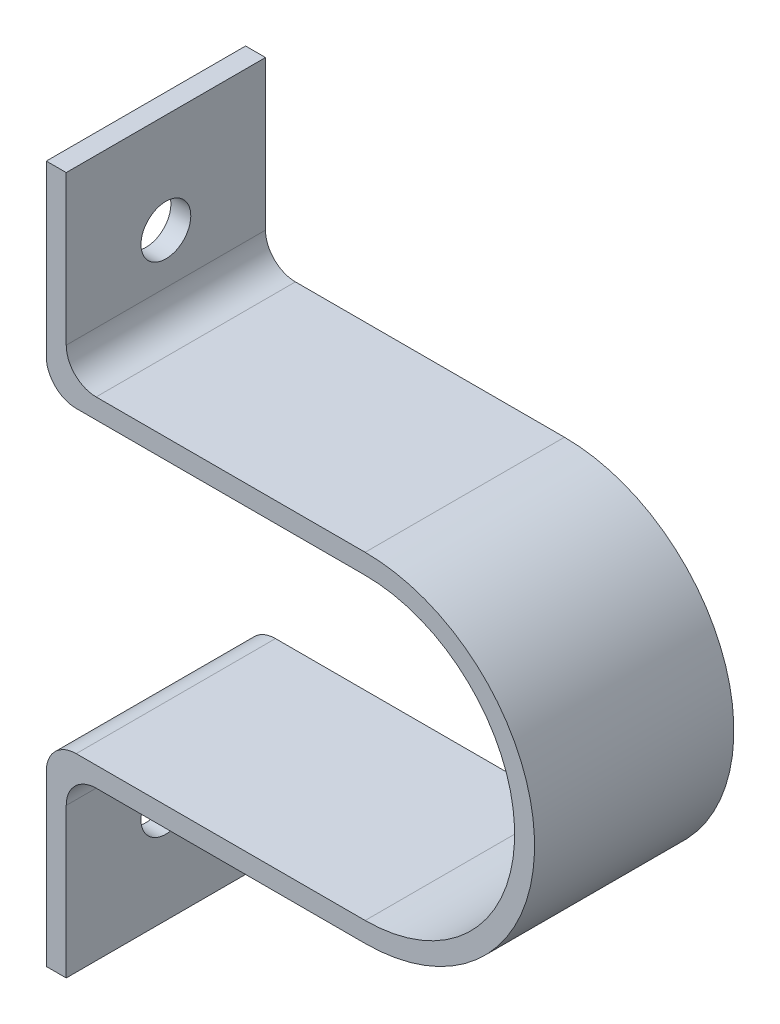
ISO-10303-21;
HEADER;
FILE_DESCRIPTION(('STEP AP214'),'2;1');
FILE_NAME('part.step','',(''),(''),'','','');
FILE_SCHEMA(('AUTOMOTIVE_DESIGN { 1 0 10303 214 1 1 1 1 }'));
ENDSEC;
DATA;
#1=APPLICATION_CONTEXT('core data for automotive mechanical design processes');
#2=APPLICATION_PROTOCOL_DEFINITION('international standard','automotive_design',2000,#1);
#3=PRODUCT_CONTEXT('',#1,'mechanical');
#4=PRODUCT('Part','Part','',(#3));
#5=PRODUCT_RELATED_PRODUCT_CATEGORY('part','',(#4));
#6=PRODUCT_DEFINITION_FORMATION('','',#4);
#7=PRODUCT_DEFINITION_CONTEXT('part definition',#1,'design');
#8=PRODUCT_DEFINITION('design','',#6,#7);
#9=PRODUCT_DEFINITION_SHAPE('','',#8);
#10=(LENGTH_UNIT() NAMED_UNIT(*) SI_UNIT(.MILLI.,.METRE.));
#11=(NAMED_UNIT(*) PLANE_ANGLE_UNIT() SI_UNIT($,.RADIAN.));
#12=(NAMED_UNIT(*) SI_UNIT($,.STERADIAN.) SOLID_ANGLE_UNIT());
#13=UNCERTAINTY_MEASURE_WITH_UNIT(LENGTH_MEASURE(1.E-05),#10,'distance_accuracy_value','');
#14=(GEOMETRIC_REPRESENTATION_CONTEXT(3) GLOBAL_UNCERTAINTY_ASSIGNED_CONTEXT((#13)) GLOBAL_UNIT_ASSIGNED_CONTEXT((#10,
#11,#12)) REPRESENTATION_CONTEXT('',''));
#15=CARTESIAN_POINT('',(0.,0.,0.));
#16=DIRECTION('',(0.,0.,1.));
#17=DIRECTION('',(1.,0.,0.));
#18=AXIS2_PLACEMENT_3D('',#15,#16,#17);
#19=CARTESIAN_POINT('',(40.,-37.,-30.));
#20=DIRECTION('',(0.,-1.,0.));
#21=DIRECTION('',(0.,0.,-1.));
#22=AXIS2_PLACEMENT_3D('',#19,#20,#21);
#23=PLANE('',#22);
#24=DIRECTION('',(1.,0.,0.));
#25=VECTOR('',#24,1.);
#26=CARTESIAN_POINT('',(40.,-37.,-10.));
#27=LINE('',#26,#25);
#28=CARTESIAN_POINT('',(13.,-37.,-10.));
#29=VERTEX_POINT('',#28);
#30=CARTESIAN_POINT('',(40.,-37.,-10.));
#31=VERTEX_POINT('',#30);
#32=EDGE_CURVE('E194',#29,#31,#27,.T.);
#33=ORIENTED_EDGE('',*,*,#32,.F.);
#34=DIRECTION('',(0.,0.,1.));
#35=VECTOR('',#34,1.);
#36=CARTESIAN_POINT('',(13.,-37.,-30.));
#37=LINE('',#36,#35);
#38=CARTESIAN_POINT('',(13.,-37.,-30.));
#39=VERTEX_POINT('',#38);
#40=EDGE_CURVE('E150',#29,#39,#37,.F.);
#41=ORIENTED_EDGE('',*,*,#40,.T.);
#42=DIRECTION('',(1.,0.,0.));
#43=VECTOR('',#42,1.);
#44=CARTESIAN_POINT('',(40.,-37.,-30.));
#45=LINE('',#44,#43);
#46=CARTESIAN_POINT('',(40.,-37.,-30.));
#47=VERTEX_POINT('',#46);
#48=EDGE_CURVE('E144',#39,#47,#45,.T.);
#49=ORIENTED_EDGE('',*,*,#48,.T.);
#50=DIRECTION('',(0.,0.,1.));
#51=VECTOR('',#50,1.);
#52=CARTESIAN_POINT('',(40.,-37.,-30.));
#53=LINE('',#52,#51);
#54=EDGE_CURVE('E147',#47,#31,#53,.T.);
#55=ORIENTED_EDGE('',*,*,#54,.T.);
#56=EDGE_LOOP('',(#33,#41,#49,#55));
#57=FACE_BOUND('',#56,.T.);
#58=ADVANCED_FACE('F31',(#57),#23,.T.);
#59=CARTESIAN_POINT('',(10.,-37.,-30.));
#60=DIRECTION('',(1.,0.,0.));
#61=DIRECTION('',(0.,1.,0.));
#62=AXIS2_PLACEMENT_3D('',#59,#60,#61);
#63=PLANE('',#62);
#64=CARTESIAN_POINT('',(10.,-45.,-20.));
#65=DIRECTION('',(1.,0.,0.));
#66=DIRECTION('',(0.,1.,0.));
#67=AXIS2_PLACEMENT_3D('',#64,#65,#66);
#68=CIRCLE('',#67,2.5);
#69=CARTESIAN_POINT('',(10.,-42.5,-20.));
#70=VERTEX_POINT('',#69);
#71=EDGE_CURVE('E499',#70,#70,#68,.T.);
#72=ORIENTED_EDGE('',*,*,#71,.F.);
#73=EDGE_LOOP('',(#72));
#74=FACE_BOUND('',#73,.T.);
#75=DIRECTION('',(0.,1.,0.));
#76=VECTOR('',#75,1.);
#77=CARTESIAN_POINT('',(10.,-37.,-30.));
#78=LINE('',#77,#76);
#79=CARTESIAN_POINT('',(10.,-55.,-30.));
#80=VERTEX_POINT('',#79);
#81=CARTESIAN_POINT('',(10.,-40.,-30.));
#82=VERTEX_POINT('',#81);
#83=EDGE_CURVE('E162',#80,#82,#78,.T.);
#84=ORIENTED_EDGE('',*,*,#83,.T.);
#85=DIRECTION('',(0.,0.,1.));
#86=VECTOR('',#85,1.);
#87=CARTESIAN_POINT('',(10.,-40.,-10.));
#88=LINE('',#87,#86);
#89=CARTESIAN_POINT('',(10.,-40.,-10.));
#90=VERTEX_POINT('',#89);
#91=EDGE_CURVE('E226',#82,#90,#88,.T.);
#92=ORIENTED_EDGE('',*,*,#91,.T.);
#93=DIRECTION('',(0.,1.,0.));
#94=VECTOR('',#93,1.);
#95=CARTESIAN_POINT('',(10.,-37.,-10.));
#96=LINE('',#95,#94);
#97=CARTESIAN_POINT('',(10.,-55.,-10.));
#98=VERTEX_POINT('',#97);
#99=EDGE_CURVE('E154',#98,#90,#96,.T.);
#100=ORIENTED_EDGE('',*,*,#99,.F.);
#101=DIRECTION('',(0.,0.,1.));
#102=VECTOR('',#101,1.);
#103=CARTESIAN_POINT('',(10.,-55.,-30.));
#104=LINE('',#103,#102);
#105=EDGE_CURVE('E224',#80,#98,#104,.T.);
#106=ORIENTED_EDGE('',*,*,#105,.F.);
#107=EDGE_LOOP('',(#84,#92,#100,#106));
#108=FACE_BOUND('',#107,.T.);
#109=ADVANCED_FACE('F285',(#74,#108),#63,.T.);
#110=CARTESIAN_POINT('',(8.,-55.,-30.));
#111=DIRECTION('',(0.,-1.,0.));
#112=DIRECTION('',(0.,0.,-1.));
#113=AXIS2_PLACEMENT_3D('',#110,#111,#112);
#114=PLANE('',#113);
#115=DIRECTION('',(1.,0.,0.));
#116=VECTOR('',#115,1.);
#117=CARTESIAN_POINT('',(8.,-55.,-10.));
#118=LINE('',#117,#116);
#119=CARTESIAN_POINT('',(8.,-55.,-10.));
#120=VERTEX_POINT('',#119);
#121=EDGE_CURVE('E219',#120,#98,#118,.T.);
#122=ORIENTED_EDGE('',*,*,#121,.F.);
#123=DIRECTION('',(0.,0.,1.));
#124=VECTOR('',#123,1.);
#125=CARTESIAN_POINT('',(8.,-55.,-30.));
#126=LINE('',#125,#124);
#127=CARTESIAN_POINT('',(8.,-55.,-30.));
#128=VERTEX_POINT('',#127);
#129=EDGE_CURVE('E227',#128,#120,#126,.T.);
#130=ORIENTED_EDGE('',*,*,#129,.F.);
#131=DIRECTION('',(1.,0.,0.));
#132=VECTOR('',#131,1.);
#133=CARTESIAN_POINT('',(8.,-55.,-30.));
#134=LINE('',#133,#132);
#135=EDGE_CURVE('E189',#128,#80,#134,.T.);
#136=ORIENTED_EDGE('',*,*,#135,.T.);
#137=ORIENTED_EDGE('',*,*,#105,.T.);
#138=EDGE_LOOP('',(#122,#130,#136,#137));
#139=FACE_BOUND('',#138,.T.);
#140=ADVANCED_FACE('F290',(#139),#114,.T.);
#141=CARTESIAN_POINT('',(8.,-35.,-30.));
#142=DIRECTION('',(-1.,0.,0.));
#143=DIRECTION('',(0.,0.,1.));
#144=AXIS2_PLACEMENT_3D('',#141,#142,#143);
#145=PLANE('',#144);
#146=CARTESIAN_POINT('',(8.,-45.,-20.));
#147=DIRECTION('',(1.,0.,0.));
#148=DIRECTION('',(0.,1.,0.));
#149=AXIS2_PLACEMENT_3D('',#146,#147,#148);
#150=CIRCLE('',#149,2.5);
#151=CARTESIAN_POINT('',(8.,-42.5,-20.));
#152=VERTEX_POINT('',#151);
#153=EDGE_CURVE('E496',#152,#152,#150,.T.);
#154=ORIENTED_EDGE('',*,*,#153,.T.);
#155=EDGE_LOOP('',(#154));
#156=FACE_BOUND('',#155,.T.);
#157=DIRECTION('',(0.,-1.,0.));
#158=VECTOR('',#157,1.);
#159=CARTESIAN_POINT('',(8.,-35.,-10.));
#160=LINE('',#159,#158);
#161=CARTESIAN_POINT('',(8.,-38.,-10.));
#162=VERTEX_POINT('',#161);
#163=EDGE_CURVE('E217',#162,#120,#160,.T.);
#164=ORIENTED_EDGE('',*,*,#163,.F.);
#165=DIRECTION('',(0.,0.,1.));
#166=VECTOR('',#165,1.);
#167=CARTESIAN_POINT('',(8.,-38.,-30.));
#168=LINE('',#167,#166);
#169=CARTESIAN_POINT('',(8.,-38.,-30.));
#170=VERTEX_POINT('',#169);
#171=EDGE_CURVE('E251',#162,#170,#168,.F.);
#172=ORIENTED_EDGE('',*,*,#171,.T.);
#173=DIRECTION('',(0.,-1.,0.));
#174=VECTOR('',#173,1.);
#175=CARTESIAN_POINT('',(8.,-35.,-30.));
#176=LINE('',#175,#174);
#177=EDGE_CURVE('E187',#170,#128,#176,.T.);
#178=ORIENTED_EDGE('',*,*,#177,.T.);
#179=ORIENTED_EDGE('',*,*,#129,.T.);
#180=EDGE_LOOP('',(#164,#172,#178,#179));
#181=FACE_BOUND('',#180,.T.);
#182=ADVANCED_FACE('F431',(#156,#181),#145,.T.);
#183=CARTESIAN_POINT('',(40.,-35.,-30.));
#184=DIRECTION('',(0.,1.,0.));
#185=DIRECTION('',(0.,0.,1.));
#186=AXIS2_PLACEMENT_3D('',#183,#184,#185);
#187=PLANE('',#186);
#188=DIRECTION('',(-1.,0.,0.));
#189=VECTOR('',#188,1.);
#190=CARTESIAN_POINT('',(40.,-35.,-30.));
#191=LINE('',#190,#189);
#192=CARTESIAN_POINT('',(40.,-35.,-30.));
#193=VERTEX_POINT('',#192);
#194=CARTESIAN_POINT('',(11.,-35.,-30.));
#195=VERTEX_POINT('',#194);
#196=EDGE_CURVE('E184',#193,#195,#191,.T.);
#197=ORIENTED_EDGE('',*,*,#196,.T.);
#198=DIRECTION('',(0.,0.,1.));
#199=VECTOR('',#198,1.);
#200=CARTESIAN_POINT('',(11.,-35.,-30.));
#201=LINE('',#200,#199);
#202=CARTESIAN_POINT('',(11.,-35.,-10.));
#203=VERTEX_POINT('',#202);
#204=EDGE_CURVE('E244',#195,#203,#201,.T.);
#205=ORIENTED_EDGE('',*,*,#204,.T.);
#206=DIRECTION('',(-1.,0.,0.));
#207=VECTOR('',#206,1.);
#208=CARTESIAN_POINT('',(40.,-35.,-10.));
#209=LINE('',#208,#207);
#210=CARTESIAN_POINT('',(40.,-35.,-10.));
#211=VERTEX_POINT('',#210);
#212=EDGE_CURVE('E214',#211,#203,#209,.T.);
#213=ORIENTED_EDGE('',*,*,#212,.F.);
#214=DIRECTION('',(0.,0.,1.));
#215=VECTOR('',#214,1.);
#216=CARTESIAN_POINT('',(40.,-35.,-30.));
#217=LINE('',#216,#215);
#218=EDGE_CURVE('E230',#193,#211,#217,.T.);
#219=ORIENTED_EDGE('',*,*,#218,.F.);
#220=EDGE_LOOP('',(#197,#205,#213,#219));
#221=FACE_BOUND('',#220,.T.);
#222=ADVANCED_FACE('F300',(#221),#187,.T.);
#223=CARTESIAN_POINT('',(40.,-20.,-30.));
#224=DIRECTION('',(0.,0.,1.));
#225=DIRECTION('',(1.,0.,0.));
#226=AXIS2_PLACEMENT_3D('',#223,#224,#225);
#227=CYLINDRICAL_SURFACE('',#226,15.);
#228=CARTESIAN_POINT('',(40.,-20.,-10.));
#229=DIRECTION('',(0.,0.,-1.));
#230=DIRECTION('',(1.,0.,0.));
#231=AXIS2_PLACEMENT_3D('',#228,#229,#230);
#232=CIRCLE('',#231,15.);
#233=CARTESIAN_POINT('',(40.,-4.99999999999998,-10.));
#234=VERTEX_POINT('',#233);
#235=EDGE_CURVE('E211',#234,#211,#232,.T.);
#236=ORIENTED_EDGE('',*,*,#235,.F.);
#237=DIRECTION('',(0.,0.,1.));
#238=VECTOR('',#237,1.);
#239=CARTESIAN_POINT('',(40.,-4.99999999999998,-30.));
#240=LINE('',#239,#238);
#241=CARTESIAN_POINT('',(40.,-4.99999999999998,-30.));
#242=VERTEX_POINT('',#241);
#243=EDGE_CURVE('E232',#242,#234,#240,.T.);
#244=ORIENTED_EDGE('',*,*,#243,.F.);
#245=CARTESIAN_POINT('',(40.,-20.,-30.));
#246=DIRECTION('',(0.,0.,-1.));
#247=DIRECTION('',(1.,0.,0.));
#248=AXIS2_PLACEMENT_3D('',#245,#246,#247);
#249=CIRCLE('',#248,15.);
#250=EDGE_CURVE('E181',#242,#193,#249,.T.);
#251=ORIENTED_EDGE('',*,*,#250,.T.);
#252=ORIENTED_EDGE('',*,*,#218,.T.);
#253=EDGE_LOOP('',(#236,#244,#251,#252));
#254=FACE_BOUND('',#253,.T.);
#255=ADVANCED_FACE('F306',(#254),#227,.F.);
#256=CARTESIAN_POINT('',(40.,-5.,-30.));
#257=DIRECTION('',(0.,-1.,0.));
#258=DIRECTION('',(1.,0.,0.));
#259=AXIS2_PLACEMENT_3D('',#256,#257,#258);
#260=PLANE('',#259);
#261=DIRECTION('',(1.,0.,0.));
#262=VECTOR('',#261,1.);
#263=CARTESIAN_POINT('',(40.,-5.,-10.));
#264=LINE('',#263,#262);
#265=CARTESIAN_POINT('',(11.,-5.,-10.));
#266=VERTEX_POINT('',#265);
#267=EDGE_CURVE('E209',#266,#234,#264,.T.);
#268=ORIENTED_EDGE('',*,*,#267,.F.);
#269=DIRECTION('',(0.,0.,1.));
#270=VECTOR('',#269,1.);
#271=CARTESIAN_POINT('',(11.,-5.,-30.));
#272=LINE('',#271,#270);
#273=CARTESIAN_POINT('',(11.,-5.,-30.));
#274=VERTEX_POINT('',#273);
#275=EDGE_CURVE('E260',#266,#274,#272,.F.);
#276=ORIENTED_EDGE('',*,*,#275,.T.);
#277=DIRECTION('',(1.,0.,0.));
#278=VECTOR('',#277,1.);
#279=CARTESIAN_POINT('',(40.,-5.,-30.));
#280=LINE('',#279,#278);
#281=EDGE_CURVE('E179',#274,#242,#280,.T.);
#282=ORIENTED_EDGE('',*,*,#281,.T.);
#283=ORIENTED_EDGE('',*,*,#243,.T.);
#284=EDGE_LOOP('',(#268,#276,#282,#283));
#285=FACE_BOUND('',#284,.T.);
#286=ADVANCED_FACE('F330',(#285),#260,.T.);
#287=CARTESIAN_POINT('',(8.,-5.,-30.));
#288=DIRECTION('',(-1.,0.,0.));
#289=DIRECTION('',(0.,-1.,0.));
#290=AXIS2_PLACEMENT_3D('',#287,#288,#289);
#291=PLANE('',#290);
#292=CARTESIAN_POINT('',(7.99999999999999,4.99999999999999,-20.));
#293=DIRECTION('',(1.,0.,0.));
#294=DIRECTION('',(0.,1.,0.));
#295=AXIS2_PLACEMENT_3D('',#292,#293,#294);
#296=CIRCLE('',#295,2.5);
#297=CARTESIAN_POINT('',(7.99999999999999,7.49999999999999,-20.));
#298=VERTEX_POINT('',#297);
#299=EDGE_CURVE('E196',#298,#298,#296,.T.);
#300=ORIENTED_EDGE('',*,*,#299,.T.);
#301=EDGE_LOOP('',(#300));
#302=FACE_BOUND('',#301,.T.);
#303=DIRECTION('',(0.,-1.,0.));
#304=VECTOR('',#303,1.);
#305=CARTESIAN_POINT('',(8.,-5.,-30.));
#306=LINE('',#305,#304);
#307=CARTESIAN_POINT('',(8.,15.,-30.));
#308=VERTEX_POINT('',#307);
#309=CARTESIAN_POINT('',(8.,-2.,-30.));
#310=VERTEX_POINT('',#309);
#311=EDGE_CURVE('E176',#308,#310,#306,.T.);
#312=ORIENTED_EDGE('',*,*,#311,.T.);
#313=DIRECTION('',(0.,0.,1.));
#314=VECTOR('',#313,1.);
#315=CARTESIAN_POINT('',(8.,-2.,-30.));
#316=LINE('',#315,#314);
#317=CARTESIAN_POINT('',(8.,-2.,-10.));
#318=VERTEX_POINT('',#317);
#319=EDGE_CURVE('E257',#310,#318,#316,.T.);
#320=ORIENTED_EDGE('',*,*,#319,.T.);
#321=DIRECTION('',(0.,-1.,0.));
#322=VECTOR('',#321,1.);
#323=CARTESIAN_POINT('',(8.,-5.,-10.));
#324=LINE('',#323,#322);
#325=CARTESIAN_POINT('',(8.,15.,-10.));
#326=VERTEX_POINT('',#325);
#327=EDGE_CURVE('E206',#326,#318,#324,.T.);
#328=ORIENTED_EDGE('',*,*,#327,.F.);
#329=DIRECTION('',(0.,0.,1.));
#330=VECTOR('',#329,1.);
#331=CARTESIAN_POINT('',(8.,15.,-30.));
#332=LINE('',#331,#330);
#333=EDGE_CURVE('E235',#308,#326,#332,.T.);
#334=ORIENTED_EDGE('',*,*,#333,.F.);
#335=EDGE_LOOP('',(#312,#320,#328,#334));
#336=FACE_BOUND('',#335,.T.);
#337=ADVANCED_FACE('F318',(#302,#336),#291,.T.);
#338=CARTESIAN_POINT('',(8.,15.,-30.));
#339=DIRECTION('',(0.,1.,0.));
#340=DIRECTION('',(0.,0.,1.));
#341=AXIS2_PLACEMENT_3D('',#338,#339,#340);
#342=PLANE('',#341);
#343=DIRECTION('',(-1.,0.,0.));
#344=VECTOR('',#343,1.);
#345=CARTESIAN_POINT('',(8.,15.,-10.));
#346=LINE('',#345,#344);
#347=CARTESIAN_POINT('',(10.,15.,-10.));
#348=VERTEX_POINT('',#347);
#349=EDGE_CURVE('E203',#348,#326,#346,.T.);
#350=ORIENTED_EDGE('',*,*,#349,.F.);
#351=DIRECTION('',(0.,0.,1.));
#352=VECTOR('',#351,1.);
#353=CARTESIAN_POINT('',(10.,15.,-30.));
#354=LINE('',#353,#352);
#355=CARTESIAN_POINT('',(10.,15.,-30.));
#356=VERTEX_POINT('',#355);
#357=EDGE_CURVE('E237',#356,#348,#354,.T.);
#358=ORIENTED_EDGE('',*,*,#357,.F.);
#359=DIRECTION('',(-1.,0.,0.));
#360=VECTOR('',#359,1.);
#361=CARTESIAN_POINT('',(8.,15.,-30.));
#362=LINE('',#361,#360);
#363=EDGE_CURVE('E173',#356,#308,#362,.T.);
#364=ORIENTED_EDGE('',*,*,#363,.T.);
#365=ORIENTED_EDGE('',*,*,#333,.T.);
#366=EDGE_LOOP('',(#350,#358,#364,#365));
#367=FACE_BOUND('',#366,.T.);
#368=ADVANCED_FACE('F320',(#367),#342,.T.);
#369=CARTESIAN_POINT('',(10.,-3.,-30.));
#370=DIRECTION('',(1.,0.,0.));
#371=DIRECTION('',(0.,1.,0.));
#372=AXIS2_PLACEMENT_3D('',#369,#370,#371);
#373=PLANE('',#372);
#374=CARTESIAN_POINT('',(10.,4.99999999999999,-20.));
#375=DIRECTION('',(1.,0.,0.));
#376=DIRECTION('',(0.,1.,0.));
#377=AXIS2_PLACEMENT_3D('',#374,#375,#376);
#378=CIRCLE('',#377,2.5);
#379=CARTESIAN_POINT('',(10.,7.49999999999999,-20.));
#380=VERTEX_POINT('',#379);
#381=EDGE_CURVE('E495',#380,#380,#378,.T.);
#382=ORIENTED_EDGE('',*,*,#381,.F.);
#383=EDGE_LOOP('',(#382));
#384=FACE_BOUND('',#383,.T.);
#385=DIRECTION('',(0.,1.,0.));
#386=VECTOR('',#385,1.);
#387=CARTESIAN_POINT('',(10.,-3.,-10.));
#388=LINE('',#387,#386);
#389=CARTESIAN_POINT('',(10.,0.,-10.));
#390=VERTEX_POINT('',#389);
#391=EDGE_CURVE('E201',#390,#348,#388,.T.);
#392=ORIENTED_EDGE('',*,*,#391,.F.);
#393=DIRECTION('',(0.,0.,1.));
#394=VECTOR('',#393,1.);
#395=CARTESIAN_POINT('',(10.,0.,-30.));
#396=LINE('',#395,#394);
#397=CARTESIAN_POINT('',(10.,0.,-30.));
#398=VERTEX_POINT('',#397);
#399=EDGE_CURVE('E52',#390,#398,#396,.F.);
#400=ORIENTED_EDGE('',*,*,#399,.T.);
#401=DIRECTION('',(0.,1.,0.));
#402=VECTOR('',#401,1.);
#403=CARTESIAN_POINT('',(10.,-3.,-30.));
#404=LINE('',#403,#402);
#405=EDGE_CURVE('E168',#398,#356,#404,.T.);
#406=ORIENTED_EDGE('',*,*,#405,.T.);
#407=ORIENTED_EDGE('',*,*,#357,.T.);
#408=EDGE_LOOP('',(#392,#400,#406,#407));
#409=FACE_BOUND('',#408,.T.);
#410=ADVANCED_FACE('F274',(#384,#409),#373,.T.);
#411=CARTESIAN_POINT('',(40.,-2.99999999999998,-30.));
#412=DIRECTION('',(0.,1.,0.));
#413=DIRECTION('',(-1.,0.,0.));
#414=AXIS2_PLACEMENT_3D('',#411,#412,#413);
#415=PLANE('',#414);
#416=DIRECTION('',(-1.,0.,0.));
#417=VECTOR('',#416,1.);
#418=CARTESIAN_POINT('',(40.,-2.99999999999998,-30.));
#419=LINE('',#418,#417);
#420=CARTESIAN_POINT('',(40.,-2.99999999999998,-30.));
#421=VERTEX_POINT('',#420);
#422=CARTESIAN_POINT('',(13.,-3.,-30.));
#423=VERTEX_POINT('',#422);
#424=EDGE_CURVE('E166',#421,#423,#419,.T.);
#425=ORIENTED_EDGE('',*,*,#424,.T.);
#426=DIRECTION('',(0.,0.,1.));
#427=VECTOR('',#426,1.);
#428=CARTESIAN_POINT('',(13.,-3.,-10.));
#429=LINE('',#428,#427);
#430=CARTESIAN_POINT('',(13.,-3.,-10.));
#431=VERTEX_POINT('',#430);
#432=EDGE_CURVE('E262',#423,#431,#429,.T.);
#433=ORIENTED_EDGE('',*,*,#432,.T.);
#434=DIRECTION('',(-1.,0.,0.));
#435=VECTOR('',#434,1.);
#436=CARTESIAN_POINT('',(40.,-2.99999999999998,-10.));
#437=LINE('',#436,#435);
#438=CARTESIAN_POINT('',(40.,-2.99999999999998,-10.));
#439=VERTEX_POINT('',#438);
#440=EDGE_CURVE('E198',#439,#431,#437,.T.);
#441=ORIENTED_EDGE('',*,*,#440,.F.);
#442=DIRECTION('',(0.,0.,1.));
#443=VECTOR('',#442,1.);
#444=CARTESIAN_POINT('',(40.,-2.99999999999998,-30.));
#445=LINE('',#444,#443);
#446=EDGE_CURVE('E161',#421,#439,#445,.T.);
#447=ORIENTED_EDGE('',*,*,#446,.F.);
#448=EDGE_LOOP('',(#425,#433,#441,#447));
#449=FACE_BOUND('',#448,.T.);
#450=ADVANCED_FACE('F278',(#449),#415,.T.);
#451=CARTESIAN_POINT('',(40.,-20.,-30.));
#452=DIRECTION('',(0.,0.,1.));
#453=DIRECTION('',(1.,0.,0.));
#454=AXIS2_PLACEMENT_3D('',#451,#452,#453);
#455=CYLINDRICAL_SURFACE('',#454,17.);
#456=CARTESIAN_POINT('',(40.,-20.,-10.));
#457=DIRECTION('',(0.,0.,1.));
#458=DIRECTION('',(1.,0.,0.));
#459=AXIS2_PLACEMENT_3D('',#456,#457,#458);
#460=CIRCLE('',#459,17.);
#461=EDGE_CURVE('E160',#31,#439,#460,.T.);
#462=ORIENTED_EDGE('',*,*,#461,.F.);
#463=ORIENTED_EDGE('',*,*,#54,.F.);
#464=CARTESIAN_POINT('',(40.,-20.,-30.));
#465=DIRECTION('',(0.,0.,1.));
#466=DIRECTION('',(1.,0.,0.));
#467=AXIS2_PLACEMENT_3D('',#464,#465,#466);
#468=CIRCLE('',#467,17.);
#469=EDGE_CURVE('E153',#47,#421,#468,.T.);
#470=ORIENTED_EDGE('',*,*,#469,.T.);
#471=ORIENTED_EDGE('',*,*,#446,.T.);
#472=EDGE_LOOP('',(#462,#463,#470,#471));
#473=FACE_BOUND('',#472,.T.);
#474=ADVANCED_FACE('F158',(#473),#455,.T.);
#475=CARTESIAN_POINT('',(40.,-20.,-30.));
#476=DIRECTION('',(0.,0.,1.));
#477=DIRECTION('',(1.,0.,0.));
#478=AXIS2_PLACEMENT_3D('',#475,#476,#477);
#479=PLANE('',#478);
#480=ORIENTED_EDGE('',*,*,#177,.F.);
#481=CARTESIAN_POINT('',(11.,-38.,-30.));
#482=DIRECTION('',(0.,0.,1.));
#483=DIRECTION('',(1.,0.,0.));
#484=AXIS2_PLACEMENT_3D('',#481,#482,#483);
#485=CIRCLE('',#484,3.);
#486=EDGE_CURVE('E255',#170,#195,#485,.F.);
#487=ORIENTED_EDGE('',*,*,#486,.T.);
#488=ORIENTED_EDGE('',*,*,#196,.F.);
#489=ORIENTED_EDGE('',*,*,#250,.F.);
#490=ORIENTED_EDGE('',*,*,#281,.F.);
#491=CARTESIAN_POINT('',(11.,-2.,-30.));
#492=DIRECTION('',(0.,0.,1.));
#493=DIRECTION('',(1.,0.,0.));
#494=AXIS2_PLACEMENT_3D('',#491,#492,#493);
#495=CIRCLE('',#494,3.);
#496=EDGE_CURVE('E253',#274,#310,#495,.F.);
#497=ORIENTED_EDGE('',*,*,#496,.T.);
#498=ORIENTED_EDGE('',*,*,#311,.F.);
#499=ORIENTED_EDGE('',*,*,#363,.F.);
#500=ORIENTED_EDGE('',*,*,#405,.F.);
#501=CARTESIAN_POINT('',(13.,0.,-30.));
#502=DIRECTION('',(0.,0.,1.));
#503=DIRECTION('',(1.,0.,0.));
#504=AXIS2_PLACEMENT_3D('',#501,#502,#503);
#505=CIRCLE('',#504,3.);
#506=EDGE_CURVE('E11',#398,#423,#505,.T.);
#507=ORIENTED_EDGE('',*,*,#506,.T.);
#508=ORIENTED_EDGE('',*,*,#424,.F.);
#509=ORIENTED_EDGE('',*,*,#469,.F.);
#510=ORIENTED_EDGE('',*,*,#48,.F.);
#511=CARTESIAN_POINT('',(13.,-40.,-30.));
#512=DIRECTION('',(0.,0.,1.));
#513=DIRECTION('',(1.,0.,0.));
#514=AXIS2_PLACEMENT_3D('',#511,#512,#513);
#515=CIRCLE('',#514,3.);
#516=EDGE_CURVE('E268',#39,#82,#515,.T.);
#517=ORIENTED_EDGE('',*,*,#516,.T.);
#518=ORIENTED_EDGE('',*,*,#83,.F.);
#519=ORIENTED_EDGE('',*,*,#135,.F.);
#520=EDGE_LOOP('',(#480,#487,#488,#489,#490,#497,#498,#499,#500,#507,#508,#509,#510,#517,#518,#519));
#521=FACE_BOUND('',#520,.T.);
#522=ADVANCED_FACE('F165',(#521),#479,.F.);
#523=CARTESIAN_POINT('',(40.,-20.,-10.));
#524=DIRECTION('',(0.,0.,1.));
#525=DIRECTION('',(1.,0.,0.));
#526=AXIS2_PLACEMENT_3D('',#523,#524,#525);
#527=PLANE('',#526);
#528=ORIENTED_EDGE('',*,*,#212,.T.);
#529=CARTESIAN_POINT('',(11.,-38.,-10.));
#530=DIRECTION('',(0.,0.,1.));
#531=DIRECTION('',(1.,0.,0.));
#532=AXIS2_PLACEMENT_3D('',#529,#530,#531);
#533=CIRCLE('',#532,3.);
#534=EDGE_CURVE('E249',#203,#162,#533,.T.);
#535=ORIENTED_EDGE('',*,*,#534,.T.);
#536=ORIENTED_EDGE('',*,*,#163,.T.);
#537=ORIENTED_EDGE('',*,*,#121,.T.);
#538=ORIENTED_EDGE('',*,*,#99,.T.);
#539=CARTESIAN_POINT('',(13.,-40.,-10.));
#540=DIRECTION('',(0.,0.,1.));
#541=DIRECTION('',(1.,0.,0.));
#542=AXIS2_PLACEMENT_3D('',#539,#540,#541);
#543=CIRCLE('',#542,3.);
#544=EDGE_CURVE('E266',#90,#29,#543,.F.);
#545=ORIENTED_EDGE('',*,*,#544,.T.);
#546=ORIENTED_EDGE('',*,*,#32,.T.);
#547=ORIENTED_EDGE('',*,*,#461,.T.);
#548=ORIENTED_EDGE('',*,*,#440,.T.);
#549=CARTESIAN_POINT('',(13.,0.,-10.));
#550=DIRECTION('',(0.,0.,1.));
#551=DIRECTION('',(1.,0.,0.));
#552=AXIS2_PLACEMENT_3D('',#549,#550,#551);
#553=CIRCLE('',#552,3.);
#554=EDGE_CURVE('E39',#431,#390,#553,.F.);
#555=ORIENTED_EDGE('',*,*,#554,.T.);
#556=ORIENTED_EDGE('',*,*,#391,.T.);
#557=ORIENTED_EDGE('',*,*,#349,.T.);
#558=ORIENTED_EDGE('',*,*,#327,.T.);
#559=CARTESIAN_POINT('',(11.,-2.,-10.));
#560=DIRECTION('',(0.,0.,1.));
#561=DIRECTION('',(1.,0.,0.));
#562=AXIS2_PLACEMENT_3D('',#559,#560,#561);
#563=CIRCLE('',#562,3.);
#564=EDGE_CURVE('E247',#318,#266,#563,.T.);
#565=ORIENTED_EDGE('',*,*,#564,.T.);
#566=ORIENTED_EDGE('',*,*,#267,.T.);
#567=ORIENTED_EDGE('',*,*,#235,.T.);
#568=EDGE_LOOP('',(#528,#535,#536,#537,#538,#545,#546,#547,#548,#555,#556,#557,#558,#565,#566,#567));
#569=FACE_BOUND('',#568,.T.);
#570=ADVANCED_FACE('F270',(#569),#527,.T.);
#571=CARTESIAN_POINT('',(7.99999999999999,4.99999999999999,-20.));
#572=DIRECTION('',(1.,0.,0.));
#573=DIRECTION('',(0.,1.,0.));
#574=AXIS2_PLACEMENT_3D('',#571,#572,#573);
#575=CYLINDRICAL_SURFACE('',#574,2.5);
#576=ORIENTED_EDGE('',*,*,#299,.F.);
#577=EDGE_LOOP('',(#576));
#578=FACE_BOUND('',#577,.T.);
#579=ORIENTED_EDGE('',*,*,#381,.T.);
#580=EDGE_LOOP('',(#579));
#581=FACE_BOUND('',#580,.T.);
#582=ADVANCED_FACE('F380',(#578,#581),#575,.F.);
#583=CARTESIAN_POINT('',(8.,-45.,-20.));
#584=DIRECTION('',(1.,0.,0.));
#585=DIRECTION('',(0.,1.,0.));
#586=AXIS2_PLACEMENT_3D('',#583,#584,#585);
#587=CYLINDRICAL_SURFACE('',#586,2.5);
#588=ORIENTED_EDGE('',*,*,#153,.F.);
#589=EDGE_LOOP('',(#588));
#590=FACE_BOUND('',#589,.T.);
#591=ORIENTED_EDGE('',*,*,#71,.T.);
#592=EDGE_LOOP('',(#591));
#593=FACE_BOUND('',#592,.T.);
#594=ADVANCED_FACE('F345',(#590,#593),#587,.F.);
#595=CARTESIAN_POINT('',(13.,-40.,-30.));
#596=DIRECTION('',(0.,0.,-1.));
#597=DIRECTION('',(-1.,0.,0.));
#598=AXIS2_PLACEMENT_3D('',#595,#596,#597);
#599=CYLINDRICAL_SURFACE('',#598,3.);
#600=ORIENTED_EDGE('',*,*,#516,.F.);
#601=ORIENTED_EDGE('',*,*,#40,.F.);
#602=ORIENTED_EDGE('',*,*,#544,.F.);
#603=ORIENTED_EDGE('',*,*,#91,.F.);
#604=EDGE_LOOP('',(#600,#601,#602,#603));
#605=FACE_BOUND('',#604,.T.);
#606=ADVANCED_FACE('F280',(#605),#599,.F.);
#607=CARTESIAN_POINT('',(11.,-38.,-30.));
#608=DIRECTION('',(0.,0.,1.));
#609=DIRECTION('',(1.,0.,0.));
#610=AXIS2_PLACEMENT_3D('',#607,#608,#609);
#611=CYLINDRICAL_SURFACE('',#610,3.);
#612=ORIENTED_EDGE('',*,*,#486,.F.);
#613=ORIENTED_EDGE('',*,*,#171,.F.);
#614=ORIENTED_EDGE('',*,*,#534,.F.);
#615=ORIENTED_EDGE('',*,*,#204,.F.);
#616=EDGE_LOOP('',(#612,#613,#614,#615));
#617=FACE_BOUND('',#616,.T.);
#618=ADVANCED_FACE('F297',(#617),#611,.T.);
#619=CARTESIAN_POINT('',(11.,-2.,-30.));
#620=DIRECTION('',(0.,0.,1.));
#621=DIRECTION('',(1.,0.,0.));
#622=AXIS2_PLACEMENT_3D('',#619,#620,#621);
#623=CYLINDRICAL_SURFACE('',#622,3.);
#624=ORIENTED_EDGE('',*,*,#496,.F.);
#625=ORIENTED_EDGE('',*,*,#275,.F.);
#626=ORIENTED_EDGE('',*,*,#564,.F.);
#627=ORIENTED_EDGE('',*,*,#319,.F.);
#628=EDGE_LOOP('',(#624,#625,#626,#627));
#629=FACE_BOUND('',#628,.T.);
#630=ADVANCED_FACE('F315',(#629),#623,.T.);
#631=CARTESIAN_POINT('',(13.,0.,-30.));
#632=DIRECTION('',(0.,0.,-1.));
#633=DIRECTION('',(-1.,0.,0.));
#634=AXIS2_PLACEMENT_3D('',#631,#632,#633);
#635=CYLINDRICAL_SURFACE('',#634,3.);
#636=ORIENTED_EDGE('',*,*,#506,.F.);
#637=ORIENTED_EDGE('',*,*,#399,.F.);
#638=ORIENTED_EDGE('',*,*,#554,.F.);
#639=ORIENTED_EDGE('',*,*,#432,.F.);
#640=EDGE_LOOP('',(#636,#637,#638,#639));
#641=FACE_BOUND('',#640,.T.);
#642=ADVANCED_FACE('F33',(#641),#635,.F.);
#643=CLOSED_SHELL('',(#58,#109,#140,#182,#222,#255,#286,#337,#368,#410,#450,#474,#522,#570,#582,
#594,#606,#618,#630,#642));
#644=MANIFOLD_SOLID_BREP('B2',#643);
#645=ADVANCED_BREP_SHAPE_REPRESENTATION('',(#18,#644),#14);
#646=SHAPE_DEFINITION_REPRESENTATION(#9,#645);
ENDSEC;
END-ISO-10303-21;
